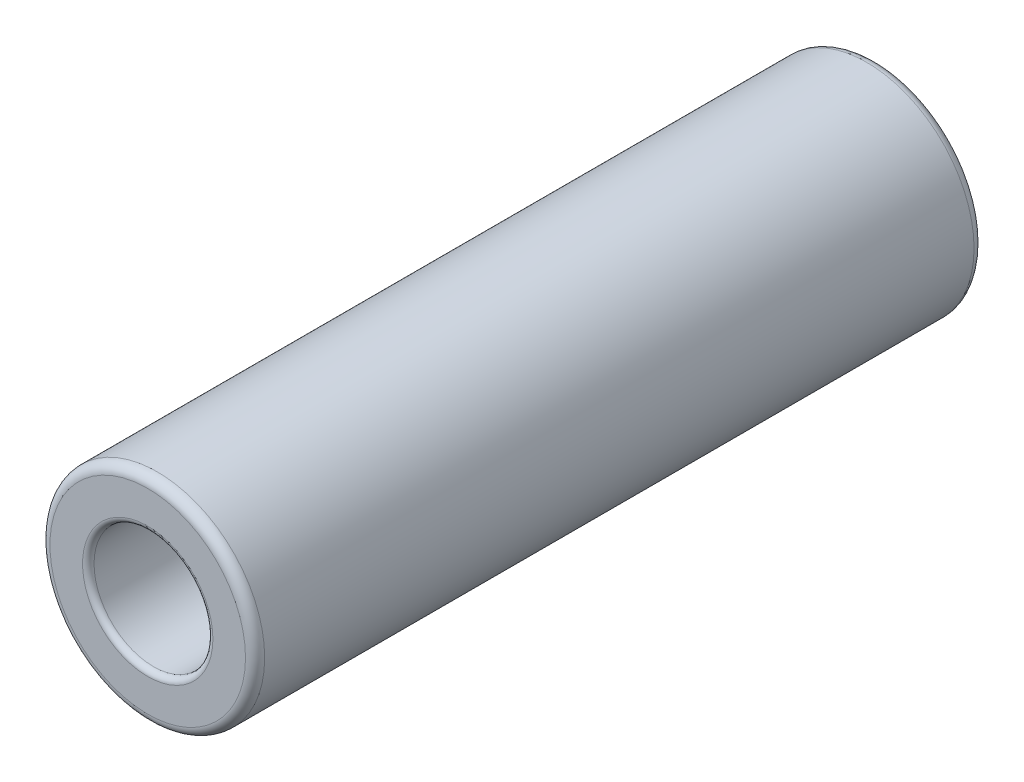
ISO-10303-21;
HEADER;
FILE_DESCRIPTION(('STEP AP214'),'2;1');
FILE_NAME('part.step','',(''),(''),'','','');
FILE_SCHEMA(('AUTOMOTIVE_DESIGN { 1 0 10303 214 1 1 1 1 }'));
ENDSEC;
DATA;
#1=APPLICATION_CONTEXT('core data for automotive mechanical design processes');
#2=APPLICATION_PROTOCOL_DEFINITION('international standard','automotive_design',2000,#1);
#3=PRODUCT_CONTEXT('',#1,'mechanical');
#4=PRODUCT('Part','Part','',(#3));
#5=PRODUCT_RELATED_PRODUCT_CATEGORY('part','',(#4));
#6=PRODUCT_DEFINITION_FORMATION('','',#4);
#7=PRODUCT_DEFINITION_CONTEXT('part definition',#1,'design');
#8=PRODUCT_DEFINITION('design','',#6,#7);
#9=PRODUCT_DEFINITION_SHAPE('','',#8);
#10=(LENGTH_UNIT() NAMED_UNIT(*) SI_UNIT(.MILLI.,.METRE.));
#11=(NAMED_UNIT(*) PLANE_ANGLE_UNIT() SI_UNIT($,.RADIAN.));
#12=(NAMED_UNIT(*) SI_UNIT($,.STERADIAN.) SOLID_ANGLE_UNIT());
#13=UNCERTAINTY_MEASURE_WITH_UNIT(LENGTH_MEASURE(1.E-05),#10,'distance_accuracy_value','');
#14=(GEOMETRIC_REPRESENTATION_CONTEXT(3) GLOBAL_UNCERTAINTY_ASSIGNED_CONTEXT((#13)) GLOBAL_UNIT_ASSIGNED_CONTEXT((#10,
#11,#12)) REPRESENTATION_CONTEXT('',''));
#15=CARTESIAN_POINT('',(0.,0.,0.));
#16=DIRECTION('',(0.,0.,1.));
#17=DIRECTION('',(1.,0.,0.));
#18=AXIS2_PLACEMENT_3D('',#15,#16,#17);
#19=CARTESIAN_POINT('',(0.,0.,96.52));
#20=DIRECTION('',(0.,0.,1.));
#21=DIRECTION('',(1.,0.,0.));
#22=AXIS2_PLACEMENT_3D('',#19,#20,#21);
#23=PLANE('',#22);
#24=CARTESIAN_POINT('',(0.,0.,96.52));
#25=DIRECTION('',(0.,0.,1.));
#26=DIRECTION('',(1.,0.,0.));
#27=AXIS2_PLACEMENT_3D('',#24,#25,#26);
#28=CIRCLE('',#27,8.636);
#29=CARTESIAN_POINT('',(8.636,0.,96.52));
#30=VERTEX_POINT('',#29);
#31=EDGE_CURVE('E10',#30,#30,#28,.F.);
#32=ORIENTED_EDGE('',*,*,#31,.T.);
#33=EDGE_LOOP('',(#32));
#34=FACE_BOUND('',#33,.T.);
#35=CARTESIAN_POINT('',(0.,0.,96.52));
#36=DIRECTION('',(0.,0.,1.));
#37=DIRECTION('',(1.,0.,0.));
#38=AXIS2_PLACEMENT_3D('',#35,#36,#37);
#39=CIRCLE('',#38,12.954);
#40=CARTESIAN_POINT('',(12.954,0.,96.52));
#41=VERTEX_POINT('',#40);
#42=EDGE_CURVE('E52',#41,#41,#39,.T.);
#43=ORIENTED_EDGE('',*,*,#42,.T.);
#44=EDGE_LOOP('',(#43));
#45=FACE_BOUND('',#44,.T.);
#46=ADVANCED_FACE('F32',(#34,#45),#23,.T.);
#47=CARTESIAN_POINT('',(0.,0.,0.));
#48=DIRECTION('',(0.,0.,1.));
#49=DIRECTION('',(1.,0.,0.));
#50=AXIS2_PLACEMENT_3D('',#47,#48,#49);
#51=PLANE('',#50);
#52=CARTESIAN_POINT('',(0.,0.,0.));
#53=DIRECTION('',(0.,0.,1.));
#54=DIRECTION('',(1.,0.,0.));
#55=AXIS2_PLACEMENT_3D('',#52,#53,#54);
#56=CIRCLE('',#55,8.636);
#57=CARTESIAN_POINT('',(8.636,0.,0.));
#58=VERTEX_POINT('',#57);
#59=EDGE_CURVE('E47',#58,#58,#56,.T.);
#60=ORIENTED_EDGE('',*,*,#59,.T.);
#61=EDGE_LOOP('',(#60));
#62=FACE_BOUND('',#61,.T.);
#63=CARTESIAN_POINT('',(0.,0.,0.));
#64=DIRECTION('',(0.,0.,1.));
#65=DIRECTION('',(1.,0.,0.));
#66=AXIS2_PLACEMENT_3D('',#63,#64,#65);
#67=CIRCLE('',#66,12.954);
#68=CARTESIAN_POINT('',(12.954,0.,0.));
#69=VERTEX_POINT('',#68);
#70=EDGE_CURVE('E55',#69,#69,#67,.F.);
#71=ORIENTED_EDGE('',*,*,#70,.T.);
#72=EDGE_LOOP('',(#71));
#73=FACE_BOUND('',#72,.T.);
#74=ADVANCED_FACE('F76',(#62,#73),#51,.F.);
#75=CARTESIAN_POINT('',(0.,0.,96.52));
#76=DIRECTION('',(0.,0.,-1.));
#77=DIRECTION('',(-1.,0.,0.));
#78=AXIS2_PLACEMENT_3D('',#75,#76,#77);
#79=CYLINDRICAL_SURFACE('',#78,14.224);
#80=CARTESIAN_POINT('',(0.,0.,1.26999999999999));
#81=DIRECTION('',(0.,0.,1.));
#82=DIRECTION('',(1.,0.,0.));
#83=AXIS2_PLACEMENT_3D('',#80,#81,#82);
#84=CIRCLE('',#83,14.224);
#85=CARTESIAN_POINT('',(-14.224,0.,1.26999999999998));
#86=VERTEX_POINT('',#85);
#87=EDGE_CURVE('E58',#86,#86,#84,.T.);
#88=CARTESIAN_POINT('',(0.,0.,95.25));
#89=DIRECTION('',(0.,0.,1.));
#90=DIRECTION('',(1.,0.,0.));
#91=AXIS2_PLACEMENT_3D('',#88,#89,#90);
#92=CIRCLE('',#91,14.224);
#93=CARTESIAN_POINT('',(-14.224,0.,95.25));
#94=VERTEX_POINT('',#93);
#95=EDGE_CURVE('E61',#94,#94,#92,.F.);
#96=CARTESIAN_POINT('',(-14.224,0.,1.26999999999998));
#97=CARTESIAN_POINT('',(-14.224,0.,2.24895833333331));
#98=CARTESIAN_POINT('',(-14.224,0.,3.22791666666665));
#99=CARTESIAN_POINT('',(-14.224,0.,5.18583333333332));
#100=CARTESIAN_POINT('',(-14.224,0.,6.16479166666665));
#101=CARTESIAN_POINT('',(-14.224,0.,8.12270833333331));
#102=CARTESIAN_POINT('',(-14.224,0.,9.10166666666665));
#103=CARTESIAN_POINT('',(-14.224,0.,11.0595833333333));
#104=CARTESIAN_POINT('',(-14.224,0.,12.0385416666667));
#105=CARTESIAN_POINT('',(-14.224,0.,13.9964583333333));
#106=CARTESIAN_POINT('',(-14.224,0.,14.9754166666666));
#107=CARTESIAN_POINT('',(-14.224,0.,16.9333333333333));
#108=CARTESIAN_POINT('',(-14.224,0.,17.9122916666667));
#109=CARTESIAN_POINT('',(-14.224,0.,19.8702083333333));
#110=CARTESIAN_POINT('',(-14.224,0.,20.8491666666667));
#111=CARTESIAN_POINT('',(-14.224,0.,22.8070833333333));
#112=CARTESIAN_POINT('',(-14.224,0.,23.7860416666666));
#113=CARTESIAN_POINT('',(-14.224,0.,25.7439583333333));
#114=CARTESIAN_POINT('',(-14.224,0.,26.7229166666667));
#115=CARTESIAN_POINT('',(-14.224,0.,28.6808333333333));
#116=CARTESIAN_POINT('',(-14.224,0.,29.6597916666666));
#117=CARTESIAN_POINT('',(-14.224,0.,31.6177083333333));
#118=CARTESIAN_POINT('',(-14.224,0.,32.5966666666666));
#119=CARTESIAN_POINT('',(-14.224,0.,34.5545833333333));
#120=CARTESIAN_POINT('',(-14.224,0.,35.5335416666667));
#121=CARTESIAN_POINT('',(-14.224,0.,37.4914583333333));
#122=CARTESIAN_POINT('',(-14.224,0.,38.4704166666666));
#123=CARTESIAN_POINT('',(-14.224,0.,40.4283333333333));
#124=CARTESIAN_POINT('',(-14.224,0.,41.4072916666666));
#125=CARTESIAN_POINT('',(-14.224,0.,43.3652083333333));
#126=CARTESIAN_POINT('',(-14.224,0.,44.3441666666667));
#127=CARTESIAN_POINT('',(-14.224,0.,46.3020833333333));
#128=CARTESIAN_POINT('',(-14.224,0.,47.2810416666666));
#129=CARTESIAN_POINT('',(-14.224,0.,49.2389583333333));
#130=CARTESIAN_POINT('',(-14.224,0.,50.2179166666666));
#131=CARTESIAN_POINT('',(-14.224,0.,52.1758333333333));
#132=CARTESIAN_POINT('',(-14.224,0.,53.1547916666667));
#133=CARTESIAN_POINT('',(-14.224,0.,55.1127083333333));
#134=CARTESIAN_POINT('',(-14.224,0.,56.0916666666667));
#135=CARTESIAN_POINT('',(-14.224,0.,58.0495833333333));
#136=CARTESIAN_POINT('',(-14.224,0.,59.0285416666666));
#137=CARTESIAN_POINT('',(-14.224,0.,60.9864583333333));
#138=CARTESIAN_POINT('',(-14.224,0.,61.9654166666667));
#139=CARTESIAN_POINT('',(-14.224,0.,63.9233333333333));
#140=CARTESIAN_POINT('',(-14.224,0.,64.9022916666667));
#141=CARTESIAN_POINT('',(-14.224,0.,66.8602083333333));
#142=CARTESIAN_POINT('',(-14.224,0.,67.8391666666666));
#143=CARTESIAN_POINT('',(-14.224,0.,69.7970833333333));
#144=CARTESIAN_POINT('',(-14.224,0.,70.7760416666667));
#145=CARTESIAN_POINT('',(-14.224,0.,72.7339583333333));
#146=CARTESIAN_POINT('',(-14.224,0.,73.7129166666666));
#147=CARTESIAN_POINT('',(-14.224,0.,75.6708333333333));
#148=CARTESIAN_POINT('',(-14.224,0.,76.6497916666666));
#149=CARTESIAN_POINT('',(-14.224,0.,78.6077083333333));
#150=CARTESIAN_POINT('',(-14.224,0.,79.5866666666667));
#151=CARTESIAN_POINT('',(-14.224,0.,81.5445833333333));
#152=CARTESIAN_POINT('',(-14.224,0.,82.5235416666666));
#153=CARTESIAN_POINT('',(-14.224,0.,84.4814583333333));
#154=CARTESIAN_POINT('',(-14.224,0.,85.4604166666666));
#155=CARTESIAN_POINT('',(-14.224,0.,87.4183333333333));
#156=CARTESIAN_POINT('',(-14.224,0.,88.3972916666667));
#157=CARTESIAN_POINT('',(-14.224,0.,90.3552083333333));
#158=CARTESIAN_POINT('',(-14.224,0.,91.3341666666666));
#159=CARTESIAN_POINT('',(-14.224,0.,93.2920833333333));
#160=CARTESIAN_POINT('',(-14.224,0.,94.2710416666666));
#161=CARTESIAN_POINT('',(-14.224,0.,95.25));
#162=B_SPLINE_CURVE_WITH_KNOTS('',3,(#96,#97,#98,#99,#100,#101,#102,#103,#104,#105,#106,#107,
#108,#109,#110,#111,#112,#113,#114,#115,#116,#117,#118,#119,#120,#121,#122,#123,#124,#125,#126,
#127,#128,#129,#130,#131,#132,#133,#134,#135,#136,#137,#138,#139,#140,#141,#142,#143,#144,#145,
#146,#147,#148,#149,#150,#151,#152,#153,#154,#155,#156,#157,#158,#159,#160,#161),.UNSPECIFIED.,
.F.,.F.,(4,2,2,2,2,2,2,2,2,2,2,2,2,2,2,2,2,2,2,2,2,2,2,2,2,2,2,2,2,2,2,2,4),(0.,
2.93687500000001,5.87375,8.810625,11.7475,14.684375,17.62125,20.558125,23.495,26.431875,
29.36875,32.305625,35.2425,38.179375,41.11625,44.053125,46.99,49.926875,52.86375,55.800625,
58.7375,61.674375,64.61125,67.548125,70.485,73.421875,76.35875,79.295625,82.2325,85.169375,
88.10625,91.043125,93.98),.UNSPECIFIED.);
#163=EDGE_CURVE('BSEAM65',#86,#94,#162,.T.);
#164=ORIENTED_EDGE('',*,*,#87,.T.);
#165=ORIENTED_EDGE('',*,*,#95,.T.);
#166=ORIENTED_EDGE('',*,*,#163,.T.);
#167=ORIENTED_EDGE('',*,*,#163,.F.);
#168=EDGE_LOOP('',(#164,#166,#165,#167));
#169=FACE_BOUND('',#168,.T.);
#170=ADVANCED_FACE('F65',(#169),#79,.T.);
#171=CARTESIAN_POINT('',(0.,0.,96.52));
#172=DIRECTION('',(0.,0.,-1.));
#173=DIRECTION('',(-1.,0.,0.));
#174=AXIS2_PLACEMENT_3D('',#171,#172,#173);
#175=CYLINDRICAL_SURFACE('',#174,7.874);
#176=CARTESIAN_POINT('',(0.,0.,0.761999999999999));
#177=DIRECTION('',(0.,0.,1.));
#178=DIRECTION('',(1.,0.,0.));
#179=AXIS2_PLACEMENT_3D('',#176,#177,#178);
#180=CIRCLE('',#179,7.874);
#181=CARTESIAN_POINT('',(-7.874,0.,0.761999999999999));
#182=VERTEX_POINT('',#181);
#183=EDGE_CURVE('E39',#182,#182,#180,.F.);
#184=CARTESIAN_POINT('',(0.,0.,95.758));
#185=DIRECTION('',(0.,0.,1.));
#186=DIRECTION('',(1.,0.,0.));
#187=AXIS2_PLACEMENT_3D('',#184,#185,#186);
#188=CIRCLE('',#187,7.874);
#189=CARTESIAN_POINT('',(-7.874,0.,95.758));
#190=VERTEX_POINT('',#189);
#191=EDGE_CURVE('E43',#190,#190,#188,.T.);
#192=CARTESIAN_POINT('',(-7.874,0.,0.761999999999999));
#193=CARTESIAN_POINT('',(-7.874,0.,1.75154166666667));
#194=CARTESIAN_POINT('',(-7.874,0.,2.74108333333333));
#195=CARTESIAN_POINT('',(-7.874,0.,4.72016666666667));
#196=CARTESIAN_POINT('',(-7.874,0.,5.70970833333334));
#197=CARTESIAN_POINT('',(-7.874,0.,7.68879166666667));
#198=CARTESIAN_POINT('',(-7.874,0.,8.67833333333334));
#199=CARTESIAN_POINT('',(-7.874,0.,10.6574166666667));
#200=CARTESIAN_POINT('',(-7.874,0.,11.6469583333333));
#201=CARTESIAN_POINT('',(-7.874,0.,13.6260416666667));
#202=CARTESIAN_POINT('',(-7.874,0.,14.6155833333333));
#203=CARTESIAN_POINT('',(-7.874,0.,16.5946666666667));
#204=CARTESIAN_POINT('',(-7.874,0.,17.5842083333333));
#205=CARTESIAN_POINT('',(-7.874,0.,19.5632916666667));
#206=CARTESIAN_POINT('',(-7.874,0.,20.5528333333333));
#207=CARTESIAN_POINT('',(-7.874,0.,22.5319166666667));
#208=CARTESIAN_POINT('',(-7.874,0.,23.5214583333333));
#209=CARTESIAN_POINT('',(-7.874,0.,25.5005416666667));
#210=CARTESIAN_POINT('',(-7.874,0.,26.4900833333333));
#211=CARTESIAN_POINT('',(-7.874,0.,28.4691666666667));
#212=CARTESIAN_POINT('',(-7.874,0.,29.4587083333333));
#213=CARTESIAN_POINT('',(-7.874,0.,31.4377916666667));
#214=CARTESIAN_POINT('',(-7.874,0.,32.4273333333333));
#215=CARTESIAN_POINT('',(-7.874,0.,34.4064166666667));
#216=CARTESIAN_POINT('',(-7.874,0.,35.3959583333333));
#217=CARTESIAN_POINT('',(-7.874,0.,37.3750416666667));
#218=CARTESIAN_POINT('',(-7.874,0.,38.3645833333333));
#219=CARTESIAN_POINT('',(-7.874,0.,40.3436666666667));
#220=CARTESIAN_POINT('',(-7.874,0.,41.3332083333333));
#221=CARTESIAN_POINT('',(-7.874,0.,43.3122916666667));
#222=CARTESIAN_POINT('',(-7.874,0.,44.3018333333333));
#223=CARTESIAN_POINT('',(-7.874,0.,46.2809166666667));
#224=CARTESIAN_POINT('',(-7.874,0.,47.2704583333333));
#225=CARTESIAN_POINT('',(-7.874,0.,49.2495416666667));
#226=CARTESIAN_POINT('',(-7.874,0.,50.2390833333333));
#227=CARTESIAN_POINT('',(-7.874,0.,52.2181666666667));
#228=CARTESIAN_POINT('',(-7.874,0.,53.2077083333333));
#229=CARTESIAN_POINT('',(-7.874,0.,55.1867916666667));
#230=CARTESIAN_POINT('',(-7.874,0.,56.1763333333333));
#231=CARTESIAN_POINT('',(-7.874,0.,58.1554166666667));
#232=CARTESIAN_POINT('',(-7.874,0.,59.1449583333333));
#233=CARTESIAN_POINT('',(-7.874,0.,61.1240416666666));
#234=CARTESIAN_POINT('',(-7.874,0.,62.1135833333333));
#235=CARTESIAN_POINT('',(-7.874,0.,64.0926666666666));
#236=CARTESIAN_POINT('',(-7.874,0.,65.0822083333333));
#237=CARTESIAN_POINT('',(-7.874,0.,67.0612916666666));
#238=CARTESIAN_POINT('',(-7.874,0.,68.0508333333333));
#239=CARTESIAN_POINT('',(-7.874,0.,70.0299166666667));
#240=CARTESIAN_POINT('',(-7.874,0.,71.0194583333333));
#241=CARTESIAN_POINT('',(-7.874,0.,72.9985416666667));
#242=CARTESIAN_POINT('',(-7.874,0.,73.9880833333333));
#243=CARTESIAN_POINT('',(-7.874,0.,75.9671666666666));
#244=CARTESIAN_POINT('',(-7.874,0.,76.9567083333333));
#245=CARTESIAN_POINT('',(-7.874,0.,78.9357916666666));
#246=CARTESIAN_POINT('',(-7.874,0.,79.9253333333333));
#247=CARTESIAN_POINT('',(-7.874,0.,81.9044166666666));
#248=CARTESIAN_POINT('',(-7.874,0.,82.8939583333333));
#249=CARTESIAN_POINT('',(-7.874,0.,84.8730416666667));
#250=CARTESIAN_POINT('',(-7.874,0.,85.8625833333333));
#251=CARTESIAN_POINT('',(-7.874,0.,87.8416666666667));
#252=CARTESIAN_POINT('',(-7.874,0.,88.8312083333333));
#253=CARTESIAN_POINT('',(-7.874,0.,90.8102916666666));
#254=CARTESIAN_POINT('',(-7.874,0.,91.7998333333333));
#255=CARTESIAN_POINT('',(-7.874,0.,93.7789166666666));
#256=CARTESIAN_POINT('',(-7.874,0.,94.7684583333333));
#257=CARTESIAN_POINT('',(-7.874,0.,95.758));
#258=B_SPLINE_CURVE_WITH_KNOTS('',3,(#192,#193,#194,#195,#196,#197,#198,#199,#200,#201,#202,
#203,#204,#205,#206,#207,#208,#209,#210,#211,#212,#213,#214,#215,#216,#217,#218,#219,#220,#221,
#222,#223,#224,#225,#226,#227,#228,#229,#230,#231,#232,#233,#234,#235,#236,#237,#238,#239,#240,
#241,#242,#243,#244,#245,#246,#247,#248,#249,#250,#251,#252,#253,#254,#255,#256,#257),
.UNSPECIFIED.,.F.,.F.,(4,2,2,2,2,2,2,2,2,2,2,2,2,2,2,2,2,2,2,2,2,2,2,2,2,2,2,2,2,2,2,2,4),(0.,
2.968625,5.93725000000001,8.90587500000001,11.8745,14.843125,17.81175,20.780375,23.749,
26.717625,29.68625,32.654875,35.6235,38.592125,41.56075,44.529375,47.498,50.466625,53.43525,
56.403875,59.3725,62.341125,65.30975,68.278375,71.247,74.215625,77.18425,80.152875,83.1215,
86.090125,89.05875,92.027375,94.996),.UNSPECIFIED.);
#259=EDGE_CURVE('BSEAM84',#182,#190,#258,.T.);
#260=ORIENTED_EDGE('',*,*,#183,.T.);
#261=ORIENTED_EDGE('',*,*,#191,.T.);
#262=ORIENTED_EDGE('',*,*,#259,.T.);
#263=ORIENTED_EDGE('',*,*,#259,.F.);
#264=EDGE_LOOP('',(#260,#262,#261,#263));
#265=FACE_BOUND('',#264,.T.);
#266=ADVANCED_FACE('F84',(#265),#175,.F.);
#267=CARTESIAN_POINT('',(0.,0.,1.26999999999999));
#268=DIRECTION('',(0.,0.,1.));
#269=DIRECTION('',(1.,0.,0.));
#270=AXIS2_PLACEMENT_3D('',#267,#268,#269);
#271=TOROIDAL_SURFACE('',#270,12.954,1.27);
#272=ORIENTED_EDGE('',*,*,#70,.F.);
#273=EDGE_LOOP('',(#272));
#274=FACE_BOUND('',#273,.T.);
#275=ORIENTED_EDGE('',*,*,#87,.F.);
#276=EDGE_LOOP('',(#275));
#277=FACE_BOUND('',#276,.T.);
#278=ADVANCED_FACE('F71',(#274,#277),#271,.T.);
#279=CARTESIAN_POINT('',(0.,0.,95.25));
#280=DIRECTION('',(0.,0.,1.));
#281=DIRECTION('',(1.,0.,0.));
#282=AXIS2_PLACEMENT_3D('',#279,#280,#281);
#283=TOROIDAL_SURFACE('',#282,12.954,1.27);
#284=ORIENTED_EDGE('',*,*,#95,.F.);
#285=EDGE_LOOP('',(#284));
#286=FACE_BOUND('',#285,.T.);
#287=ORIENTED_EDGE('',*,*,#42,.F.);
#288=EDGE_LOOP('',(#287));
#289=FACE_BOUND('',#288,.T.);
#290=ADVANCED_FACE('F67',(#286,#289),#283,.T.);
#291=CARTESIAN_POINT('',(0.,0.,0.761999999999999));
#292=DIRECTION('',(0.,0.,1.));
#293=DIRECTION('',(1.,0.,0.));
#294=AXIS2_PLACEMENT_3D('',#291,#292,#293);
#295=TOROIDAL_SURFACE('',#294,8.636,0.762);
#296=ORIENTED_EDGE('',*,*,#183,.F.);
#297=EDGE_LOOP('',(#296));
#298=FACE_BOUND('',#297,.T.);
#299=ORIENTED_EDGE('',*,*,#59,.F.);
#300=EDGE_LOOP('',(#299));
#301=FACE_BOUND('',#300,.T.);
#302=ADVANCED_FACE('F70',(#298,#301),#295,.T.);
#303=CARTESIAN_POINT('',(0.,0.,95.758));
#304=DIRECTION('',(0.,0.,1.));
#305=DIRECTION('',(1.,0.,0.));
#306=AXIS2_PLACEMENT_3D('',#303,#304,#305);
#307=TOROIDAL_SURFACE('',#306,8.636,0.762);
#308=ORIENTED_EDGE('',*,*,#31,.F.);
#309=EDGE_LOOP('',(#308));
#310=FACE_BOUND('',#309,.T.);
#311=ORIENTED_EDGE('',*,*,#191,.F.);
#312=EDGE_LOOP('',(#311));
#313=FACE_BOUND('',#312,.T.);
#314=ADVANCED_FACE('F34',(#310,#313),#307,.T.);
#315=CLOSED_SHELL('',(#46,#74,#170,#266,#278,#290,#302,#314));
#316=MANIFOLD_SOLID_BREP('B2',#315);
#317=ADVANCED_BREP_SHAPE_REPRESENTATION('',(#18,#316),#14);
#318=SHAPE_DEFINITION_REPRESENTATION(#9,#317);
ENDSEC;
END-ISO-10303-21;
